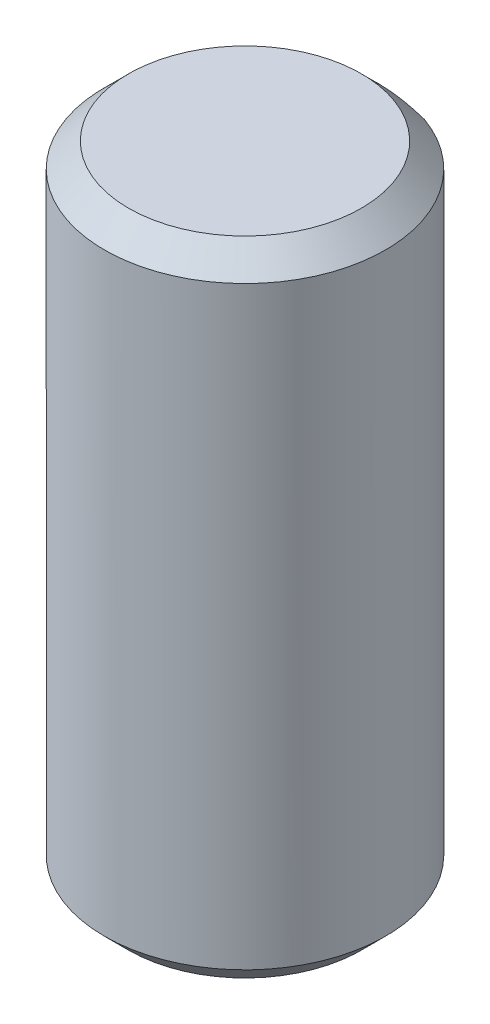
ISO-10303-21;
HEADER;
FILE_DESCRIPTION(('STEP AP214'),'2;1');
FILE_NAME('part.step','',(''),(''),'','','');
FILE_SCHEMA(('AUTOMOTIVE_DESIGN { 1 0 10303 214 1 1 1 1 }'));
ENDSEC;
DATA;
#1=APPLICATION_CONTEXT('core data for automotive mechanical design processes');
#2=APPLICATION_PROTOCOL_DEFINITION('international standard','automotive_design',2000,#1);
#3=PRODUCT_CONTEXT('',#1,'mechanical');
#4=PRODUCT('Part','Part','',(#3));
#5=PRODUCT_RELATED_PRODUCT_CATEGORY('part','',(#4));
#6=PRODUCT_DEFINITION_FORMATION('','',#4);
#7=PRODUCT_DEFINITION_CONTEXT('part definition',#1,'design');
#8=PRODUCT_DEFINITION('design','',#6,#7);
#9=PRODUCT_DEFINITION_SHAPE('','',#8);
#10=(LENGTH_UNIT() NAMED_UNIT(*) SI_UNIT(.MILLI.,.METRE.));
#11=(NAMED_UNIT(*) PLANE_ANGLE_UNIT() SI_UNIT($,.RADIAN.));
#12=(NAMED_UNIT(*) SI_UNIT($,.STERADIAN.) SOLID_ANGLE_UNIT());
#13=UNCERTAINTY_MEASURE_WITH_UNIT(LENGTH_MEASURE(1.E-05),#10,'distance_accuracy_value','');
#14=(GEOMETRIC_REPRESENTATION_CONTEXT(3) GLOBAL_UNCERTAINTY_ASSIGNED_CONTEXT((#13)) GLOBAL_UNIT_ASSIGNED_CONTEXT((#10,
#11,#12)) REPRESENTATION_CONTEXT('',''));
#15=CARTESIAN_POINT('',(0.,0.,0.));
#16=DIRECTION('',(0.,0.,1.));
#17=DIRECTION('',(1.,0.,0.));
#18=AXIS2_PLACEMENT_3D('',#15,#16,#17);
#19=CARTESIAN_POINT('',(0.,80.,0.));
#20=DIRECTION('',(0.,-1.,0.));
#21=DIRECTION('',(0.,0.,-1.));
#22=AXIS2_PLACEMENT_3D('',#19,#20,#21);
#23=CYLINDRICAL_SURFACE('',#22,17.5);
#24=CARTESIAN_POINT('',(0.,77.,0.));
#25=DIRECTION('',(0.,1.,0.));
#26=DIRECTION('',(0.,0.,1.));
#27=AXIS2_PLACEMENT_3D('',#24,#25,#26);
#28=CIRCLE('',#27,17.5);
#29=CARTESIAN_POINT('',(5.83095189484529,77.,-16.5));
#30=VERTEX_POINT('',#29);
#31=CARTESIAN_POINT('',(-5.83095189484529,77.,-16.5));
#32=VERTEX_POINT('',#31);
#33=EDGE_CURVE('E73',#30,#32,#28,.F.);
#34=ORIENTED_EDGE('',*,*,#33,.T.);
#35=DIRECTION('',(0.,-1.,0.));
#36=VECTOR('',#35,1.);
#37=CARTESIAN_POINT('',(-5.83095189484531,80.,-16.5));
#38=LINE('',#37,#36);
#39=CARTESIAN_POINT('',(-5.83095189484531,3.00000000000002,-16.5));
#40=VERTEX_POINT('',#39);
#41=EDGE_CURVE('E56',#32,#40,#38,.T.);
#42=ORIENTED_EDGE('',*,*,#41,.T.);
#43=CARTESIAN_POINT('',(0.,3.00000000000002,0.));
#44=DIRECTION('',(0.,1.,0.));
#45=DIRECTION('',(0.,0.,1.));
#46=AXIS2_PLACEMENT_3D('',#43,#44,#45);
#47=CIRCLE('',#46,17.5);
#48=CARTESIAN_POINT('',(5.83095189484531,3.00000000000002,-16.5));
#49=VERTEX_POINT('',#48);
#50=EDGE_CURVE('E75',#40,#49,#47,.T.);
#51=ORIENTED_EDGE('',*,*,#50,.T.);
#52=DIRECTION('',(0.,-1.,0.));
#53=VECTOR('',#52,1.);
#54=CARTESIAN_POINT('',(5.83095189484531,80.,-16.5));
#55=LINE('',#54,#53);
#56=EDGE_CURVE('E67',#49,#30,#55,.F.);
#57=ORIENTED_EDGE('',*,*,#56,.T.);
#58=EDGE_LOOP('',(#34,#42,#51,#57));
#59=FACE_BOUND('',#58,.T.);
#60=ADVANCED_FACE('F35',(#59),#23,.T.);
#61=CARTESIAN_POINT('',(0.,80.,0.));
#62=DIRECTION('',(0.,1.,0.));
#63=DIRECTION('',(0.,0.,1.));
#64=AXIS2_PLACEMENT_3D('',#61,#62,#63);
#65=PLANE('',#64);
#66=CARTESIAN_POINT('',(0.,80.,0.));
#67=DIRECTION('',(0.,1.,0.));
#68=DIRECTION('',(0.,0.,1.));
#69=AXIS2_PLACEMENT_3D('',#66,#67,#68);
#70=CIRCLE('',#69,14.5);
#71=CARTESIAN_POINT('',(0.,80.,14.5));
#72=VERTEX_POINT('',#71);
#73=EDGE_CURVE('E50',#72,#72,#70,.T.);
#74=ORIENTED_EDGE('',*,*,#73,.T.);
#75=EDGE_LOOP('',(#74));
#76=FACE_BOUND('',#75,.T.);
#77=ADVANCED_FACE('F92',(#76),#65,.T.);
#78=CARTESIAN_POINT('',(0.,0.,0.));
#79=DIRECTION('',(0.,1.,0.));
#80=DIRECTION('',(0.,0.,1.));
#81=AXIS2_PLACEMENT_3D('',#78,#79,#80);
#82=PLANE('',#81);
#83=CARTESIAN_POINT('',(0.,0.,0.));
#84=DIRECTION('',(0.,1.,0.));
#85=DIRECTION('',(0.,0.,1.));
#86=AXIS2_PLACEMENT_3D('',#83,#84,#85);
#87=CIRCLE('',#86,14.5);
#88=CARTESIAN_POINT('',(0.,0.,14.5));
#89=VERTEX_POINT('',#88);
#90=EDGE_CURVE('E79',#89,#89,#87,.F.);
#91=ORIENTED_EDGE('',*,*,#90,.T.);
#92=EDGE_LOOP('',(#91));
#93=FACE_BOUND('',#92,.T.);
#94=ADVANCED_FACE('F99',(#93),#82,.F.);
#95=CARTESIAN_POINT('',(0.,3.00000000000002,0.));
#96=DIRECTION('',(0.,1.,0.));
#97=DIRECTION('',(0.,0.,1.));
#98=AXIS2_PLACEMENT_3D('',#95,#96,#97);
#99=CONICAL_SURFACE('',#98,17.5,0.785398163397452);
#100=CARTESIAN_POINT('',(49.9751219737581,38.1285361405006,-16.5));
#101=CARTESIAN_POINT('',(49.1268180326746,37.3230275242618,-16.5));
#102=CARTESIAN_POINT('',(48.277530965903,36.5185518354555,-16.5));
#103=CARTESIAN_POINT('',(46.5766169286539,34.912067861863,-16.5));
#104=CARTESIAN_POINT('',(45.7249899438864,34.1100595922089,-16.5));
#105=CARTESIAN_POINT('',(44.0185712485224,32.5084886901842,-16.5));
#106=CARTESIAN_POINT('',(43.1637780748444,31.7089276159608,-16.5));
#107=CARTESIAN_POINT('',(41.4510115451001,30.1132206873381,-16.5));
#108=CARTESIAN_POINT('',(40.5930381949314,29.3170748266114,-16.5));
#109=CARTESIAN_POINT('',(38.8600497622482,27.7165997355671,-16.5));
#110=CARTESIAN_POINT('',(37.9849760757292,26.9123339240495,-16.5));
#111=CARTESIAN_POINT('',(36.230173725457,25.3088976598861,-16.5));
#112=CARTESIAN_POINT('',(35.3504450746713,24.5097271930594,-16.5));
#113=CARTESIAN_POINT('',(33.5857195331877,22.9179823818609,-16.5));
#114=CARTESIAN_POINT('',(32.7007250630151,22.125405356261,-16.5));
#115=CARTESIAN_POINT('',(30.9238220696184,20.5480415946964,-16.5));
#116=CARTESIAN_POINT('',(30.0319136004165,19.7632547979723,-16.5));
#117=CARTESIAN_POINT('',(28.3841044680247,18.3294127386647,-16.5));
#118=CARTESIAN_POINT('',(27.6294815477828,17.6788903729012,-16.5));
#119=CARTESIAN_POINT('',(26.1128549696403,16.3864625107866,-16.5));
#120=CARTESIAN_POINT('',(25.3508511778234,15.7445571712862,-16.5));
#121=CARTESIAN_POINT('',(23.8168342278165,14.4708233283654,-16.5));
#122=CARTESIAN_POINT('',(23.0448096915385,13.8390085062289,-16.5));
#123=CARTESIAN_POINT('',(21.4895214365483,12.5893835781454,-16.5));
#124=CARTESIAN_POINT('',(20.7062582992745,11.9715727519256,-16.5));
#125=CARTESIAN_POINT('',(19.521757332136,11.0594625662079,-16.5));
#126=CARTESIAN_POINT('',(19.1258448303536,10.758243273548,-16.5));
#127=CARTESIAN_POINT('',(18.3300347679493,10.1611208698934,-16.5));
#128=CARTESIAN_POINT('',(17.9301372751934,9.86521766860314,-16.5));
#129=CARTESIAN_POINT('',(17.1257292445253,9.27949935637507,-16.5));
#130=CARTESIAN_POINT('',(16.7212174365524,8.98968598721221,-16.5));
#131=CARTESIAN_POINT('',(15.907105381073,8.41729031906035,-16.5));
#132=CARTESIAN_POINT('',(15.4975051785307,8.13470795624116,-16.5));
#133=CARTESIAN_POINT('',(14.6733696219126,7.57861987685479,-16.5));
#134=CARTESIAN_POINT('',(14.258845793198,7.30509711719355,-16.5));
#135=CARTESIAN_POINT('',(13.4232925096894,6.76810546883674,-16.5));
#136=CARTESIAN_POINT('',(13.0022627780266,6.5046370096821,-16.5));
#137=CARTESIAN_POINT('',(12.153117851122,5.98985870454003,-16.5));
#138=CARTESIAN_POINT('',(11.7250065257855,5.73854249426493,-16.5));
#139=CARTESIAN_POINT('',(10.8606553293519,5.2503574835734,-16.5));
#140=CARTESIAN_POINT('',(10.4244165824666,5.0134867041048,-16.5));
#141=CARTESIAN_POINT('',(9.65497114967341,4.615162911907,-16.5));
#142=CARTESIAN_POINT('',(9.3237660632904,4.44984610990346,-16.5));
#143=CARTESIAN_POINT('',(8.65599876290476,4.13036069101458,-16.5));
#144=CARTESIAN_POINT('',(8.31943653263317,3.97619210799285,-16.5));
#145=CARTESIAN_POINT('',(7.64061485431404,3.68063863440521,-16.5));
#146=CARTESIAN_POINT('',(7.298353896011,3.53925719860858,-16.5));
#147=CARTESIAN_POINT('',(6.60809305212184,3.27120589138887,-16.5));
#148=CARTESIAN_POINT('',(6.2600932114251,3.14453590495549,-16.5));
#149=CARTESIAN_POINT('',(5.56200603258245,2.90916601950769,-16.5));
#150=CARTESIAN_POINT('',(5.21197658222542,2.80029535342531,-16.5));
#151=CARTESIAN_POINT('',(4.50669725199204,2.60105085695001,-16.5));
#152=CARTESIAN_POINT('',(4.15144793051777,2.51067506326517,-16.5));
#153=CARTESIAN_POINT('',(3.43656123630429,2.35048089609749,-16.5));
#154=CARTESIAN_POINT('',(3.07692690934596,2.28064901546146,-16.5));
#155=CARTESIAN_POINT('',(2.35404676159811,2.16326635021467,-16.5));
#156=CARTESIAN_POINT('',(1.9908014635984,2.1157123868763,-16.5));
#157=CARTESIAN_POINT('',(1.3626789892854,2.05409100982647,-16.5));
#158=CARTESIAN_POINT('',(1.09834269397719,2.0344023713908,-16.5));
#159=CARTESIAN_POINT('',(0.569035705576573,2.00769427400749,-16.5));
#160=CARTESIAN_POINT('',(0.304065050075086,2.0006740820923,-16.5));
#161=CARTESIAN_POINT('',(-0.225875990300507,1.99941854701399,-16.5));
#162=CARTESIAN_POINT('',(-0.490846372053461,2.00518180982275,-16.5));
#163=CARTESIAN_POINT('',(-1.02020936391482,2.02939536980791,-16.5));
#164=CARTESIAN_POINT('',(-1.28460196203173,2.04784592783832,-16.5));
#165=CARTESIAN_POINT('',(-1.81309980154578,2.09722543297032,-16.5));
#166=CARTESIAN_POINT('',(-2.07720119339272,2.12819549162678,-16.5));
#167=CARTESIAN_POINT('',(-2.60373027793636,2.20213783143716,-16.5));
#168=CARTESIAN_POINT('',(-2.86615778547038,2.24511141763618,-16.5));
#169=CARTESIAN_POINT('',(-3.65026069433182,2.39115008427428,-16.5));
#170=CARTESIAN_POINT('',(-4.16879185294358,2.51133651565803,-16.5));
#171=CARTESIAN_POINT('',(-5.43340589208479,2.85651505729968,-16.5));
#172=CARTESIAN_POINT('',(-6.1732557338241,3.10425653464191,-16.5));
#173=CARTESIAN_POINT('',(-7.26367168325218,3.5249327061623,-16.5));
#174=CARTESIAN_POINT('',(-7.62409053620749,3.67342095949031,-16.5));
#175=CARTESIAN_POINT('',(-8.33873688638416,3.9846185313658,-16.5));
#176=CARTESIAN_POINT('',(-8.69296491717678,4.14732661701641,-16.5));
#177=CARTESIAN_POINT('',(-9.39718047290627,4.48581512995383,-16.5));
#178=CARTESIAN_POINT('',(-9.74713933598888,4.66165477538152,-16.5));
#179=CARTESIAN_POINT('',(-10.4414791663457,5.02400557863444,-16.5));
#180=CARTESIAN_POINT('',(-10.7858600725598,5.21051685317743,-16.5));
#181=CARTESIAN_POINT('',(-11.469316053215,5.59265970819235,-16.5));
#182=CARTESIAN_POINT('',(-11.8083933236946,5.78828737280421,-16.5));
#183=CARTESIAN_POINT('',(-12.4818090840592,6.18748513923557,-16.5));
#184=CARTESIAN_POINT('',(-12.8161477728028,6.39105490640442,-16.5));
#185=CARTESIAN_POINT('',(-13.5274924911862,6.83436429226303,-16.5));
#186=CARTESIAN_POINT('',(-13.9038468988388,7.07514814995857,-16.5));
#187=CARTESIAN_POINT('',(-14.6515392881461,7.56439905540122,-16.5));
#188=CARTESIAN_POINT('',(-15.0228770465223,7.812866443515,-16.5));
#189=CARTESIAN_POINT('',(-15.7611193933915,8.31644151274365,-16.5));
#190=CARTESIAN_POINT('',(-16.128023122948,8.57155045116486,-16.5));
#191=CARTESIAN_POINT('',(-16.8578011267172,9.08747441470054,-16.5));
#192=CARTESIAN_POINT('',(-17.2206753079528,9.34828957106862,-16.5));
#193=CARTESIAN_POINT('',(-18.3044790585067,10.1385613248466,-16.5));
#194=CARTESIAN_POINT('',(-19.0200016073678,10.6754394523544,-16.5));
#195=CARTESIAN_POINT('',(-20.4393459290515,11.7642350014751,-16.5));
#196=CARTESIAN_POINT('',(-21.1431687401474,12.3161510769745,-16.5));
#197=CARTESIAN_POINT('',(-22.5432274848915,13.4332892322826,-16.5));
#198=CARTESIAN_POINT('',(-23.2394382119471,13.9985428425729,-16.5));
#199=CARTESIAN_POINT('',(-24.624079958199,15.1385053420731,-16.5));
#200=CARTESIAN_POINT('',(-25.3125108325621,15.7132144068226,-16.5));
#201=CARTESIAN_POINT('',(-26.6826023178641,16.8699958969751,-16.5));
#202=CARTESIAN_POINT('',(-27.3642659203615,17.4520647841421,-16.5));
#203=CARTESIAN_POINT('',(-28.7221997290028,18.6224435047099,-16.5));
#204=CARTESIAN_POINT('',(-29.3984699722058,19.2107532951632,-16.5));
#205=CARTESIAN_POINT('',(-30.7473637490947,20.3933377923065,-16.5));
#206=CARTESIAN_POINT('',(-31.4199812300245,20.9876193968258,-16.5));
#207=CARTESIAN_POINT('',(-32.7613440769975,22.1805350631963,-16.5));
#208=CARTESIAN_POINT('',(-33.4300894382313,22.7791691304512,-16.5));
#209=CARTESIAN_POINT('',(-34.7643317687157,23.9801806796639,-16.5));
#210=CARTESIAN_POINT('',(-35.4298284000306,24.5825585368386,-16.5));
#211=CARTESIAN_POINT('',(-36.757958644218,25.7904633178582,-16.5));
#212=CARTESIAN_POINT('',(-37.4205922507488,26.3959902486718,-16.5));
#213=CARTESIAN_POINT('',(-39.4031112499199,28.2150840196566,-16.5));
#214=CARTESIAN_POINT('',(-40.7192974881263,29.4326827249527,-16.5));
#215=CARTESIAN_POINT('',(-43.3440730806518,31.8759562380478,-16.5));
#216=CARTESIAN_POINT('',(-44.6526626448404,33.1016308207222,-16.5));
#217=CARTESIAN_POINT('',(-46.2939512494183,34.6463850232871,-16.5));
#218=CARTESIAN_POINT('',(-46.6294249799066,34.9625206549041,-16.5));
#219=CARTESIAN_POINT('',(-47.3000400113033,35.5952233609443,-16.5));
#220=CARTESIAN_POINT('',(-47.6351812684981,35.911790481716,-16.5));
#221=CARTESIAN_POINT('',(-48.3046660273149,36.5448716904177,-16.5));
#222=CARTESIAN_POINT('',(-48.639009996521,36.8613852839563,-16.5));
#223=CARTESIAN_POINT('',(-49.3073284232276,37.4947234364777,-16.5));
#224=CARTESIAN_POINT('',(-49.6413029196673,37.8115479543699,-16.5));
#225=CARTESIAN_POINT('',(-49.9751219737581,38.1285361405006,-16.5));
#226=B_SPLINE_CURVE_WITH_KNOTS('',3,(#100,#101,#102,#103,#104,#105,#106,#107,#108,#109,#110,
#111,#112,#113,#114,#115,#116,#117,#118,#119,#120,#121,#122,#123,#124,#125,#126,#127,#128,#129,
#130,#131,#132,#133,#134,#135,#136,#137,#138,#139,#140,#141,#142,#143,#144,#145,#146,#147,#148,
#149,#150,#151,#152,#153,#154,#155,#156,#157,#158,#159,#160,#161,#162,#163,#164,#165,#166,#167,
#168,#169,#170,#171,#172,#173,#174,#175,#176,#177,#178,#179,#180,#181,#182,#183,#184,#185,#186,
#187,#188,#189,#190,#191,#192,#193,#194,#195,#196,#197,#198,#199,#200,#201,#202,#203,#204,#205,
#206,#207,#208,#209,#210,#211,#212,#213,#214,#215,#216,#217,#218,#219,#220,#221,#222,#223,#224,
#225),.UNSPECIFIED.,.F.,.F.,(4,2,2,2,2,2,2,2,2,2,2,2,2,2,2,2,2,2,2,2,2,2,2,2,2,2,2,2,2,2,2,2,2,
2,2,2,2,2,2,2,2,2,2,2,2,2,2,2,2,2,2,2,2,2,2,2,2,2,2,2,2,2,4),(0.,3.50944222824245,
7.01890593640038,10.5302686085189,14.0416247723097,17.6071906976164,21.1727466953699,
24.7367739313165,28.3007733479864,31.2896553636613,34.2785917106614,37.2712852680368,
40.2638245502022,41.7562093475363,43.2485687721781,44.7413493766927,46.2341167994519,
47.7238949052812,49.2137365864814,50.7027893750995,52.1916377001532,53.3019752609022,
54.4123161942485,55.522956223544,56.6335875695577,57.7328434730426,58.8319826262761,
59.9303974972638,61.0286555930083,61.8235805407669,62.6184594944971,63.4132517714116,
64.2080603899458,65.0055004832538,65.8030273094517,67.3979747408478,69.7341039479431,
70.9033248668971,72.072444511703,73.2471982515491,74.4219648423702,75.596231392509,
76.770448516749,78.1107006127248,79.4510121647645,80.791579322074,82.1321773474051,
84.8155146825595,87.4986126043481,90.1888583448434,92.8791540859668,95.568202243947,
98.2572319089228,100.949841132359,103.642453699362,106.335340627929,109.028233518212,
114.407219129467,119.786055424186,121.168936111817,122.551979359641,123.933174506005,
125.314206708675),.UNSPECIFIED.);
#227=EDGE_CURVE('E61',#49,#40,#226,.T.);
#228=ORIENTED_EDGE('',*,*,#227,.F.);
#229=ORIENTED_EDGE('',*,*,#50,.F.);
#230=EDGE_LOOP('',(#228,#229));
#231=FACE_BOUND('',#230,.T.);
#232=ORIENTED_EDGE('',*,*,#90,.F.);
#233=EDGE_LOOP('',(#232));
#234=FACE_BOUND('',#233,.T.);
#235=ADVANCED_FACE('F94',(#231,#234),#99,.T.);
#236=CARTESIAN_POINT('',(0.,80.,0.));
#237=DIRECTION('',(0.,-1.,0.));
#238=DIRECTION('',(0.,0.,-1.));
#239=AXIS2_PLACEMENT_3D('',#236,#237,#238);
#240=CONICAL_SURFACE('',#239,14.5,0.785398163397446);
#241=CARTESIAN_POINT('',(-49.9751219737577,41.8714638594994,-16.5));
#242=CARTESIAN_POINT('',(-49.1268180326742,42.6769724757382,-16.5));
#243=CARTESIAN_POINT('',(-48.2775309659026,43.4814481645445,-16.5));
#244=CARTESIAN_POINT('',(-46.5766169286535,45.087932138137,-16.5));
#245=CARTESIAN_POINT('',(-45.7249899438861,45.889940407791,-16.5));
#246=CARTESIAN_POINT('',(-44.0185712485221,47.4915113098157,-16.5));
#247=CARTESIAN_POINT('',(-43.1637780748441,48.2910723840391,-16.5));
#248=CARTESIAN_POINT('',(-41.4510115450999,49.8867793126619,-16.5));
#249=CARTESIAN_POINT('',(-40.5930381949312,50.6829251733885,-16.5));
#250=CARTESIAN_POINT('',(-38.860049762248,52.2834002644328,-16.5));
#251=CARTESIAN_POINT('',(-37.984976075729,53.0876660759504,-16.5));
#252=CARTESIAN_POINT('',(-36.2301737254568,54.6911023401138,-16.5));
#253=CARTESIAN_POINT('',(-35.3504450746712,55.4902728069404,-16.5));
#254=CARTESIAN_POINT('',(-33.5857195331875,57.082017618139,-16.5));
#255=CARTESIAN_POINT('',(-32.700725063015,57.8745946437388,-16.5));
#256=CARTESIAN_POINT('',(-30.9238220696184,59.4519584053034,-16.5));
#257=CARTESIAN_POINT('',(-30.0319136004164,60.2367452020275,-16.5));
#258=CARTESIAN_POINT('',(-28.3841044680246,61.6705872613352,-16.5));
#259=CARTESIAN_POINT('',(-27.6294815477828,62.3211096270987,-16.5));
#260=CARTESIAN_POINT('',(-26.1128549696402,63.6135374892133,-16.5));
#261=CARTESIAN_POINT('',(-25.3508511778232,64.2554428287137,-16.5));
#262=CARTESIAN_POINT('',(-23.8168342278163,65.5291766716346,-16.5));
#263=CARTESIAN_POINT('',(-23.0448096915383,66.1609914937712,-16.5));
#264=CARTESIAN_POINT('',(-21.489521436548,67.4106164218547,-16.5));
#265=CARTESIAN_POINT('',(-20.7062582992742,68.0284272480745,-16.5));
#266=CARTESIAN_POINT('',(-19.5217573321357,68.9405374337922,-16.5));
#267=CARTESIAN_POINT('',(-19.1258448303533,69.2417567264522,-16.5));
#268=CARTESIAN_POINT('',(-18.3300347679489,69.8388791301068,-16.5));
#269=CARTESIAN_POINT('',(-17.930137275193,70.1347823313971,-16.5));
#270=CARTESIAN_POINT('',(-17.1257292445249,70.7205006436251,-16.5));
#271=CARTESIAN_POINT('',(-16.721217436552,71.010314012788,-16.5));
#272=CARTESIAN_POINT('',(-15.9071053810726,71.5827096809399,-16.5));
#273=CARTESIAN_POINT('',(-15.4975051785303,71.8652920437591,-16.5));
#274=CARTESIAN_POINT('',(-14.6733696219121,72.4213801231455,-16.5));
#275=CARTESIAN_POINT('',(-14.2588457931975,72.6949028828067,-16.5));
#276=CARTESIAN_POINT('',(-13.4232925096889,73.2318945311635,-16.5));
#277=CARTESIAN_POINT('',(-13.0022627780261,73.4953629903182,-16.5));
#278=CARTESIAN_POINT('',(-12.1531178511214,74.0101412954603,-16.5));
#279=CARTESIAN_POINT('',(-11.725006525785,74.2614575057354,-16.5));
#280=CARTESIAN_POINT('',(-10.8606553293513,74.7496425164269,-16.5));
#281=CARTESIAN_POINT('',(-10.424416582466,74.9865132958955,-16.5));
#282=CARTESIAN_POINT('',(-9.65497114967277,75.3848370880933,-16.5));
#283=CARTESIAN_POINT('',(-9.32376606328974,75.5501538900969,-16.5));
#284=CARTESIAN_POINT('',(-8.65599876290408,75.8696393089857,-16.5));
#285=CARTESIAN_POINT('',(-8.31943653263248,76.0238078920075,-16.5));
#286=CARTESIAN_POINT('',(-7.64061485431332,76.3193613655951,-16.5));
#287=CARTESIAN_POINT('',(-7.29835389601027,76.4607428013917,-16.5));
#288=CARTESIAN_POINT('',(-6.60809305212108,76.7287941086114,-16.5));
#289=CARTESIAN_POINT('',(-6.26009321142432,76.8554640950448,-16.5));
#290=CARTESIAN_POINT('',(-5.56200603258164,77.0908339804926,-16.5));
#291=CARTESIAN_POINT('',(-5.21197658222459,77.199704646575,-16.5));
#292=CARTESIAN_POINT('',(-4.50669725199119,77.3989491430502,-16.5));
#293=CARTESIAN_POINT('',(-4.1514479305169,77.4893249367351,-16.5));
#294=CARTESIAN_POINT('',(-3.43656123630339,77.6495191039027,-16.5));
#295=CARTESIAN_POINT('',(-3.07692690934505,77.7193509845387,-16.5));
#296=CARTESIAN_POINT('',(-2.35404676159717,77.8367336497855,-16.5));
#297=CARTESIAN_POINT('',(-1.99080146359745,77.8842876131238,-16.5));
#298=CARTESIAN_POINT('',(-1.36267898928442,77.9459089901736,-16.5));
#299=CARTESIAN_POINT('',(-1.09834269397621,77.9655976286093,-16.5));
#300=CARTESIAN_POINT('',(-0.569035705575565,77.9923057259926,-16.5));
#301=CARTESIAN_POINT('',(-0.304065050074065,77.9993259179077,-16.5));
#302=CARTESIAN_POINT('',(0.22587599030155,78.000581452986,-16.5));
#303=CARTESIAN_POINT('',(0.490846372054514,77.9948181901772,-16.5));
#304=CARTESIAN_POINT('',(1.02020936391589,77.970604630192,-16.5));
#305=CARTESIAN_POINT('',(1.28460196203281,77.9521540721616,-16.5));
#306=CARTESIAN_POINT('',(1.81309980154687,77.9027745670296,-16.5));
#307=CARTESIAN_POINT('',(2.07720119339382,77.8718045083731,-16.5));
#308=CARTESIAN_POINT('',(2.60373027793748,77.7978621685627,-16.5));
#309=CARTESIAN_POINT('',(2.86615778547152,77.7548885823636,-16.5));
#310=CARTESIAN_POINT('',(3.65026069433298,77.6088499157255,-16.5));
#311=CARTESIAN_POINT('',(4.16879185294475,77.4886634843417,-16.5));
#312=CARTESIAN_POINT('',(5.43340589208607,77.1434849426999,-16.5));
#313=CARTESIAN_POINT('',(6.17325573382547,76.8957434653576,-16.5));
#314=CARTESIAN_POINT('',(7.26367168325366,76.4750672938371,-16.5));
#315=CARTESIAN_POINT('',(7.62409053620901,76.326579040509,-16.5));
#316=CARTESIAN_POINT('',(8.33873688638577,76.0153814686335,-16.5));
#317=CARTESIAN_POINT('',(8.69296491717842,75.8526733829828,-16.5));
#318=CARTESIAN_POINT('',(9.39718047290799,75.5141848700453,-16.5));
#319=CARTESIAN_POINT('',(9.74713933599063,75.3383452246176,-16.5));
#320=CARTESIAN_POINT('',(10.4414791663475,74.9759944213646,-16.5));
#321=CARTESIAN_POINT('',(10.7858600725616,74.7894831468215,-16.5));
#322=CARTESIAN_POINT('',(11.4693160532169,74.4073402918065,-16.5));
#323=CARTESIAN_POINT('',(11.8083933236966,74.2117126271946,-16.5));
#324=CARTESIAN_POINT('',(12.4818090840612,73.8125148607632,-16.5));
#325=CARTESIAN_POINT('',(12.8161477728049,73.6089450935943,-16.5));
#326=CARTESIAN_POINT('',(13.5274924911884,73.1656357077356,-16.5));
#327=CARTESIAN_POINT('',(13.9038468988409,72.92485185004,-16.5));
#328=CARTESIAN_POINT('',(14.6515392881484,72.4356009445972,-16.5));
#329=CARTESIAN_POINT('',(15.0228770465246,72.1871335564834,-16.5));
#330=CARTESIAN_POINT('',(15.761119393394,71.6835584872546,-16.5));
#331=CARTESIAN_POINT('',(16.1280231229505,71.4284495488333,-16.5));
#332=CARTESIAN_POINT('',(16.8578011267198,70.9125255852975,-16.5));
#333=CARTESIAN_POINT('',(17.2206753079555,70.6517104289294,-16.5));
#334=CARTESIAN_POINT('',(18.3044790585095,69.8614386751513,-16.5));
#335=CARTESIAN_POINT('',(19.0200016073708,69.3245605476432,-16.5));
#336=CARTESIAN_POINT('',(20.4393459290546,68.2357649985223,-16.5));
#337=CARTESIAN_POINT('',(21.1431687401507,67.6838489230228,-16.5));
#338=CARTESIAN_POINT('',(22.543227484895,66.5667107677144,-16.5));
#339=CARTESIAN_POINT('',(23.2394382119507,66.001457157424,-16.5));
#340=CARTESIAN_POINT('',(24.6240799582029,64.8614946579236,-16.5));
#341=CARTESIAN_POINT('',(25.312510832566,64.2867855931739,-16.5));
#342=CARTESIAN_POINT('',(26.6826023178683,63.1300041030212,-16.5));
#343=CARTESIAN_POINT('',(27.3642659203657,62.5479352158541,-16.5));
#344=CARTESIAN_POINT('',(28.7221997290073,61.377556495286,-16.5));
#345=CARTESIAN_POINT('',(29.3984699722103,60.7892467048326,-16.5));
#346=CARTESIAN_POINT('',(30.7473637490995,59.6066622076891,-16.5));
#347=CARTESIAN_POINT('',(31.4199812300294,59.0123806031697,-16.5));
#348=CARTESIAN_POINT('',(32.7613440770025,57.819464936799,-16.5));
#349=CARTESIAN_POINT('',(33.4300894382365,57.2208308695439,-16.5));
#350=CARTESIAN_POINT('',(34.764331768721,56.019819320331,-16.5));
#351=CARTESIAN_POINT('',(35.4298284000361,55.4174414631562,-16.5));
#352=CARTESIAN_POINT('',(36.7579586442237,54.2095366821364,-16.5));
#353=CARTESIAN_POINT('',(37.4205922507546,53.6040097513226,-16.5));
#354=CARTESIAN_POINT('',(39.403111249926,51.7849159803375,-16.5));
#355=CARTESIAN_POINT('',(40.7192974881326,50.5673172750412,-16.5));
#356=CARTESIAN_POINT('',(43.3440730806585,48.1240437619455,-16.5));
#357=CARTESIAN_POINT('',(44.6526626448474,46.8983691792709,-16.5));
#358=CARTESIAN_POINT('',(46.2939512494248,45.3536149767064,-16.5));
#359=CARTESIAN_POINT('',(46.6294249799125,45.03747934509,-16.5));
#360=CARTESIAN_POINT('',(47.3000400113079,44.4047766390509,-16.5));
#361=CARTESIAN_POINT('',(47.635181268502,44.0882095182798,-16.5));
#362=CARTESIAN_POINT('',(48.3046660273176,43.4551283095793,-16.5));
#363=CARTESIAN_POINT('',(48.6390099965231,43.1386147160413,-16.5));
#364=CARTESIAN_POINT('',(49.3073284232284,42.5052765635211,-16.5));
#365=CARTESIAN_POINT('',(49.6413029196675,42.1884520456295,-16.5));
#366=CARTESIAN_POINT('',(49.9751219737577,41.8714638594994,-16.5));
#367=B_SPLINE_CURVE_WITH_KNOTS('',3,(#241,#242,#243,#244,#245,#246,#247,#248,#249,#250,#251,
#252,#253,#254,#255,#256,#257,#258,#259,#260,#261,#262,#263,#264,#265,#266,#267,#268,#269,#270,
#271,#272,#273,#274,#275,#276,#277,#278,#279,#280,#281,#282,#283,#284,#285,#286,#287,#288,#289,
#290,#291,#292,#293,#294,#295,#296,#297,#298,#299,#300,#301,#302,#303,#304,#305,#306,#307,#308,
#309,#310,#311,#312,#313,#314,#315,#316,#317,#318,#319,#320,#321,#322,#323,#324,#325,#326,#327,
#328,#329,#330,#331,#332,#333,#334,#335,#336,#337,#338,#339,#340,#341,#342,#343,#344,#345,#346,
#347,#348,#349,#350,#351,#352,#353,#354,#355,#356,#357,#358,#359,#360,#361,#362,#363,#364,#365,
#366),.UNSPECIFIED.,.F.,.F.,(4,2,2,2,2,2,2,2,2,2,2,2,2,2,2,2,2,2,2,2,2,2,2,2,2,2,2,2,2,2,2,2,2,
2,2,2,2,2,2,2,2,2,2,2,2,2,2,2,2,2,2,2,2,2,2,2,2,2,2,2,2,2,4),(0.,3.50944222824239,
7.01890593640027,10.5302686085187,14.0416247723095,17.6071906976161,21.1727466953696,
24.7367739313162,28.300773347986,31.289655363661,34.2785917106612,37.2712852680367,
40.2638245502022,41.7562093475363,43.2485687721782,44.7413493766928,46.2341167994521,
47.7238949052814,49.2137365864817,50.7027893750998,52.1916377001536,53.3019752609026,
54.412316194249,55.5229562235445,56.6335875695582,57.7328434730432,58.8319826262767,
59.9303974972644,61.028655593009,61.8235805407676,62.6184594944978,63.4132517714123,
64.2080603899465,65.0055004832546,65.8030273094525,67.3979747408487,69.7341039479443,
70.9033248668985,72.0724445117045,73.2471982515508,74.421964842372,75.596231392511,
76.7704485167511,78.1107006127272,79.4510121647672,80.7915793220769,82.1321773474082,
84.8155146825631,87.4986126043521,90.1888583448479,92.8791540859718,95.5682022439525,
98.2572319089288,100.949841132365,103.642453699369,106.335340627937,109.02823351822,
114.407219129475,119.786055424196,121.168936111825,122.551979359645,123.933174506007,
125.314206708674),.UNSPECIFIED.);
#368=EDGE_CURVE('E11',#32,#30,#367,.T.);
#369=ORIENTED_EDGE('',*,*,#368,.F.);
#370=ORIENTED_EDGE('',*,*,#33,.F.);
#371=EDGE_LOOP('',(#369,#370));
#372=FACE_BOUND('',#371,.T.);
#373=ORIENTED_EDGE('',*,*,#73,.F.);
#374=EDGE_LOOP('',(#373));
#375=FACE_BOUND('',#374,.T.);
#376=ADVANCED_FACE('F38',(#372,#375),#240,.T.);
#377=CARTESIAN_POINT('',(17.5,-1.2E-05,-16.5));
#378=DIRECTION('',(0.,0.,1.));
#379=DIRECTION('',(1.,0.,0.));
#380=AXIS2_PLACEMENT_3D('',#377,#378,#379);
#381=PLANE('',#380);
#382=ORIENTED_EDGE('',*,*,#227,.T.);
#383=ORIENTED_EDGE('',*,*,#41,.F.);
#384=ORIENTED_EDGE('',*,*,#368,.T.);
#385=ORIENTED_EDGE('',*,*,#56,.F.);
#386=EDGE_LOOP('',(#382,#383,#384,#385));
#387=FACE_BOUND('',#386,.T.);
#388=ADVANCED_FACE('F66',(#387),#381,.F.);
#389=CLOSED_SHELL('',(#60,#77,#94,#235,#376,#388));
#390=MANIFOLD_SOLID_BREP('B2',#389);
#391=ADVANCED_BREP_SHAPE_REPRESENTATION('',(#18,#390),#14);
#392=SHAPE_DEFINITION_REPRESENTATION(#9,#391);
ENDSEC;
END-ISO-10303-21;
